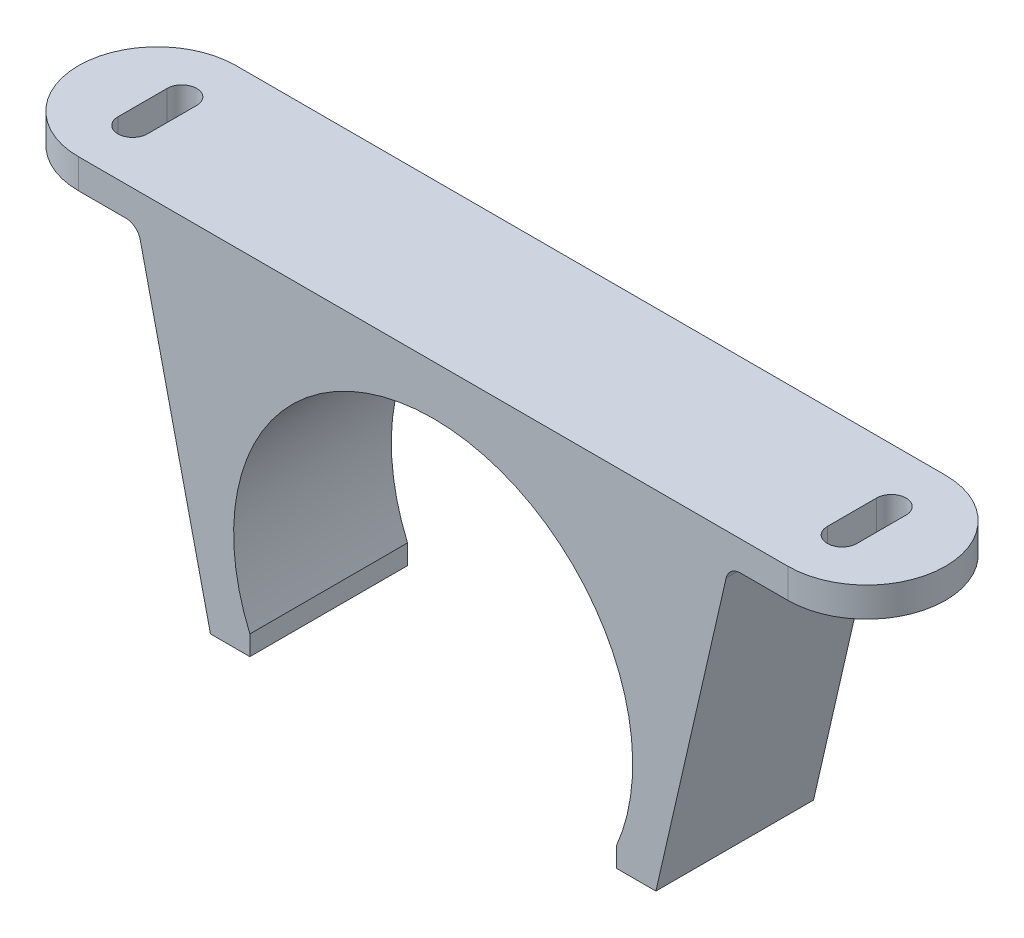
ISO-10303-21;
HEADER;
FILE_DESCRIPTION(('STEP AP214'),'2;1');
FILE_NAME('part.step','',(''),(''),'','','');
FILE_SCHEMA(('AUTOMOTIVE_DESIGN { 1 0 10303 214 1 1 1 1 }'));
ENDSEC;
DATA;
#1=APPLICATION_CONTEXT('core data for automotive mechanical design processes');
#2=APPLICATION_PROTOCOL_DEFINITION('international standard','automotive_design',2000,#1);
#3=PRODUCT_CONTEXT('',#1,'mechanical');
#4=PRODUCT('Part','Part','',(#3));
#5=PRODUCT_RELATED_PRODUCT_CATEGORY('part','',(#4));
#6=PRODUCT_DEFINITION_FORMATION('','',#4);
#7=PRODUCT_DEFINITION_CONTEXT('part definition',#1,'design');
#8=PRODUCT_DEFINITION('design','',#6,#7);
#9=PRODUCT_DEFINITION_SHAPE('','',#8);
#10=(LENGTH_UNIT() NAMED_UNIT(*) SI_UNIT(.MILLI.,.METRE.));
#11=(NAMED_UNIT(*) PLANE_ANGLE_UNIT() SI_UNIT($,.RADIAN.));
#12=(NAMED_UNIT(*) SI_UNIT($,.STERADIAN.) SOLID_ANGLE_UNIT());
#13=UNCERTAINTY_MEASURE_WITH_UNIT(LENGTH_MEASURE(1.E-05),#10,'distance_accuracy_value','');
#14=(GEOMETRIC_REPRESENTATION_CONTEXT(3) GLOBAL_UNCERTAINTY_ASSIGNED_CONTEXT((#13)) GLOBAL_UNIT_ASSIGNED_CONTEXT((#10,
#11,#12)) REPRESENTATION_CONTEXT('',''));
#15=CARTESIAN_POINT('',(0.,0.,0.));
#16=DIRECTION('',(0.,0.,1.));
#17=DIRECTION('',(1.,0.,0.));
#18=AXIS2_PLACEMENT_3D('',#15,#16,#17);
#19=CARTESIAN_POINT('',(0.,0.,16.));
#20=DIRECTION('',(0.,0.,-1.));
#21=DIRECTION('',(-1.,0.,0.));
#22=AXIS2_PLACEMENT_3D('',#19,#20,#21);
#23=CYLINDRICAL_SURFACE('',#22,20.25);
#24=CARTESIAN_POINT('',(0.,0.,0.));
#25=DIRECTION('',(0.,0.,-1.));
#26=DIRECTION('',(1.,0.,0.));
#27=AXIS2_PLACEMENT_3D('',#24,#25,#26);
#28=CIRCLE('',#27,20.25);
#29=CARTESIAN_POINT('',(-18.6027551722856,-8.,0.));
#30=VERTEX_POINT('',#29);
#31=CARTESIAN_POINT('',(18.6027551722856,-7.99999999999999,0.));
#32=VERTEX_POINT('',#31);
#33=EDGE_CURVE('E365',#30,#32,#28,.T.);
#34=ORIENTED_EDGE('',*,*,#33,.T.);
#35=DIRECTION('',(0.,0.,-1.));
#36=VECTOR('',#35,1.);
#37=CARTESIAN_POINT('',(18.6027551722856,-7.99999999999999,16.));
#38=LINE('',#37,#36);
#39=CARTESIAN_POINT('',(18.6027551722856,-7.99999999999999,16.));
#40=VERTEX_POINT('',#39);
#41=EDGE_CURVE('E325',#40,#32,#38,.T.);
#42=ORIENTED_EDGE('',*,*,#41,.F.);
#43=CARTESIAN_POINT('',(0.,0.,16.));
#44=DIRECTION('',(0.,0.,-1.));
#45=DIRECTION('',(1.,0.,0.));
#46=AXIS2_PLACEMENT_3D('',#43,#44,#45);
#47=CIRCLE('',#46,20.25);
#48=CARTESIAN_POINT('',(-18.6027551722856,-8.,16.));
#49=VERTEX_POINT('',#48);
#50=EDGE_CURVE('E286',#49,#40,#47,.T.);
#51=ORIENTED_EDGE('',*,*,#50,.F.);
#52=DIRECTION('',(0.,0.,-1.));
#53=VECTOR('',#52,1.);
#54=CARTESIAN_POINT('',(-18.6027551722856,-8.,16.));
#55=LINE('',#54,#53);
#56=EDGE_CURVE('E354',#49,#30,#55,.T.);
#57=ORIENTED_EDGE('',*,*,#56,.T.);
#58=EDGE_LOOP('',(#34,#42,#51,#57));
#59=FACE_BOUND('',#58,.T.);
#60=ADVANCED_FACE('F35',(#59),#23,.F.);
#61=CARTESIAN_POINT('',(18.6027551722856,-7.99999999999999,16.));
#62=DIRECTION('',(1.,0.,0.));
#63=DIRECTION('',(0.,0.,-1.));
#64=AXIS2_PLACEMENT_3D('',#61,#62,#63);
#65=PLANE('',#64);
#66=DIRECTION('',(0.,-1.,0.));
#67=VECTOR('',#66,1.);
#68=CARTESIAN_POINT('',(18.6027551722856,-7.99999999999999,0.));
#69=LINE('',#68,#67);
#70=CARTESIAN_POINT('',(18.6027551722856,-9.99999999999999,0.));
#71=VERTEX_POINT('',#70);
#72=EDGE_CURVE('E363',#32,#71,#69,.T.);
#73=ORIENTED_EDGE('',*,*,#72,.T.);
#74=DIRECTION('',(0.,0.,-1.));
#75=VECTOR('',#74,1.);
#76=CARTESIAN_POINT('',(18.6027551722856,-9.99999999999999,16.));
#77=LINE('',#76,#75);
#78=CARTESIAN_POINT('',(18.6027551722856,-9.99999999999999,16.));
#79=VERTEX_POINT('',#78);
#80=EDGE_CURVE('E327',#79,#71,#77,.T.);
#81=ORIENTED_EDGE('',*,*,#80,.F.);
#82=DIRECTION('',(0.,-1.,0.));
#83=VECTOR('',#82,1.);
#84=CARTESIAN_POINT('',(18.6027551722856,-7.99999999999999,16.));
#85=LINE('',#84,#83);
#86=EDGE_CURVE('E370',#40,#79,#85,.T.);
#87=ORIENTED_EDGE('',*,*,#86,.F.);
#88=ORIENTED_EDGE('',*,*,#41,.T.);
#89=EDGE_LOOP('',(#73,#81,#87,#88));
#90=FACE_BOUND('',#89,.T.);
#91=ADVANCED_FACE('F379',(#90),#65,.F.);
#92=CARTESIAN_POINT('',(18.6027551722856,-9.99999999999999,16.));
#93=DIRECTION('',(0.,1.,0.));
#94=DIRECTION('',(0.,0.,1.));
#95=AXIS2_PLACEMENT_3D('',#92,#93,#94);
#96=PLANE('',#95);
#97=DIRECTION('',(1.,0.,0.));
#98=VECTOR('',#97,1.);
#99=CARTESIAN_POINT('',(18.6027551722856,-9.99999999999999,0.));
#100=LINE('',#99,#98);
#101=CARTESIAN_POINT('',(22.6027551722856,-9.99999999999999,0.));
#102=VERTEX_POINT('',#101);
#103=EDGE_CURVE('E343',#71,#102,#100,.T.);
#104=ORIENTED_EDGE('',*,*,#103,.T.);
#105=DIRECTION('',(0.,0.,-1.));
#106=VECTOR('',#105,1.);
#107=CARTESIAN_POINT('',(22.6027551722856,-9.99999999999999,16.));
#108=LINE('',#107,#106);
#109=CARTESIAN_POINT('',(22.6027551722856,-9.99999999999999,16.));
#110=VERTEX_POINT('',#109);
#111=EDGE_CURVE('E347',#110,#102,#108,.T.);
#112=ORIENTED_EDGE('',*,*,#111,.F.);
#113=DIRECTION('',(1.,0.,0.));
#114=VECTOR('',#113,1.);
#115=CARTESIAN_POINT('',(18.6027551722856,-9.99999999999999,16.));
#116=LINE('',#115,#114);
#117=EDGE_CURVE('E339',#79,#110,#116,.T.);
#118=ORIENTED_EDGE('',*,*,#117,.F.);
#119=ORIENTED_EDGE('',*,*,#80,.T.);
#120=EDGE_LOOP('',(#104,#112,#118,#119));
#121=FACE_BOUND('',#120,.T.);
#122=ADVANCED_FACE('F384',(#121),#96,.F.);
#123=CARTESIAN_POINT('',(22.6027551722856,-9.99999999999999,16.));
#124=DIRECTION('',(-0.974688738265642,0.223566239620681,0.));
#125=DIRECTION('',(-0.223566239620681,-0.974688738265642,0.));
#126=AXIS2_PLACEMENT_3D('',#123,#124,#125);
#127=PLANE('',#126);
#128=DIRECTION('',(0.223566239620681,0.974688738265642,0.));
#129=VECTOR('',#128,1.);
#130=CARTESIAN_POINT('',(22.6027551722856,-9.99999999999999,0.));
#131=LINE('',#130,#129);
#132=CARTESIAN_POINT('',(29.7328618317196,21.085349359431,0.));
#133=VERTEX_POINT('',#132);
#134=EDGE_CURVE('E342',#102,#133,#131,.T.);
#135=ORIENTED_EDGE('',*,*,#134,.T.);
#136=DIRECTION('',(0.,0.,-1.));
#137=VECTOR('',#136,1.);
#138=CARTESIAN_POINT('',(29.7328618317196,21.085349359431,16.));
#139=LINE('',#138,#137);
#140=CARTESIAN_POINT('',(29.7328618317196,21.085349359431,16.));
#141=VERTEX_POINT('',#140);
#142=EDGE_CURVE('E50',#133,#141,#139,.F.);
#143=ORIENTED_EDGE('',*,*,#142,.T.);
#144=DIRECTION('',(0.223566239620681,0.974688738265642,0.));
#145=VECTOR('',#144,1.);
#146=CARTESIAN_POINT('',(22.6027551722856,-9.99999999999999,16.));
#147=LINE('',#146,#145);
#148=EDGE_CURVE('E322',#110,#141,#147,.T.);
#149=ORIENTED_EDGE('',*,*,#148,.F.);
#150=ORIENTED_EDGE('',*,*,#111,.T.);
#151=EDGE_LOOP('',(#135,#143,#149,#150));
#152=FACE_BOUND('',#151,.T.);
#153=ADVANCED_FACE('F423',(#152),#127,.F.);
#154=CARTESIAN_POINT('',(-30.,22.25,16.));
#155=DIRECTION('',(0.974688738265642,0.223566239620681,0.));
#156=DIRECTION('',(-0.223566239620681,0.974688738265642,0.));
#157=AXIS2_PLACEMENT_3D('',#154,#155,#156);
#158=PLANE('',#157);
#159=DIRECTION('',(0.223566239620681,-0.974688738265642,0.));
#160=VECTOR('',#159,1.);
#161=CARTESIAN_POINT('',(-30.,22.25,16.));
#162=LINE('',#161,#160);
#163=CARTESIAN_POINT('',(-29.7328618317196,21.085349359431,16.));
#164=VERTEX_POINT('',#163);
#165=CARTESIAN_POINT('',(-22.6027551722856,-10.,16.));
#166=VERTEX_POINT('',#165);
#167=EDGE_CURVE('E307',#164,#166,#162,.T.);
#168=ORIENTED_EDGE('',*,*,#167,.F.);
#169=DIRECTION('',(0.,0.,-1.));
#170=VECTOR('',#169,1.);
#171=CARTESIAN_POINT('',(-29.7328618317196,21.085349359431,16.));
#172=LINE('',#171,#170);
#173=CARTESIAN_POINT('',(-29.7328618317196,21.085349359431,0.));
#174=VERTEX_POINT('',#173);
#175=EDGE_CURVE('E316',#164,#174,#172,.T.);
#176=ORIENTED_EDGE('',*,*,#175,.T.);
#177=DIRECTION('',(0.223566239620681,-0.974688738265642,0.));
#178=VECTOR('',#177,1.);
#179=CARTESIAN_POINT('',(-30.,22.25,0.));
#180=LINE('',#179,#178);
#181=CARTESIAN_POINT('',(-22.6027551722856,-10.,0.));
#182=VERTEX_POINT('',#181);
#183=EDGE_CURVE('E331',#174,#182,#180,.T.);
#184=ORIENTED_EDGE('',*,*,#183,.T.);
#185=DIRECTION('',(0.,0.,-1.));
#186=VECTOR('',#185,1.);
#187=CARTESIAN_POINT('',(-22.6027551722856,-10.,16.));
#188=LINE('',#187,#186);
#189=EDGE_CURVE('E319',#166,#182,#188,.T.);
#190=ORIENTED_EDGE('',*,*,#189,.F.);
#191=EDGE_LOOP('',(#168,#176,#184,#190));
#192=FACE_BOUND('',#191,.T.);
#193=ADVANCED_FACE('F315',(#192),#158,.F.);
#194=CARTESIAN_POINT('',(-22.6027551722856,-10.,16.));
#195=DIRECTION('',(0.,1.,0.));
#196=DIRECTION('',(0.,0.,1.));
#197=AXIS2_PLACEMENT_3D('',#194,#195,#196);
#198=PLANE('',#197);
#199=DIRECTION('',(1.,0.,0.));
#200=VECTOR('',#199,1.);
#201=CARTESIAN_POINT('',(-22.6027551722856,-10.,0.));
#202=LINE('',#201,#200);
#203=CARTESIAN_POINT('',(-18.6027551722856,-10.,0.));
#204=VERTEX_POINT('',#203);
#205=EDGE_CURVE('E360',#182,#204,#202,.T.);
#206=ORIENTED_EDGE('',*,*,#205,.T.);
#207=DIRECTION('',(0.,0.,-1.));
#208=VECTOR('',#207,1.);
#209=CARTESIAN_POINT('',(-18.6027551722856,-10.,16.));
#210=LINE('',#209,#208);
#211=CARTESIAN_POINT('',(-18.6027551722856,-10.,16.));
#212=VERTEX_POINT('',#211);
#213=EDGE_CURVE('E351',#212,#204,#210,.T.);
#214=ORIENTED_EDGE('',*,*,#213,.F.);
#215=DIRECTION('',(1.,0.,0.));
#216=VECTOR('',#215,1.);
#217=CARTESIAN_POINT('',(-22.6027551722856,-10.,16.));
#218=LINE('',#217,#216);
#219=EDGE_CURVE('E321',#166,#212,#218,.T.);
#220=ORIENTED_EDGE('',*,*,#219,.F.);
#221=ORIENTED_EDGE('',*,*,#189,.T.);
#222=EDGE_LOOP('',(#206,#214,#220,#221));
#223=FACE_BOUND('',#222,.T.);
#224=ADVANCED_FACE('F419',(#223),#198,.F.);
#225=CARTESIAN_POINT('',(-18.6027551722856,-10.,16.));
#226=DIRECTION('',(-1.,0.,0.));
#227=DIRECTION('',(0.,0.,1.));
#228=AXIS2_PLACEMENT_3D('',#225,#226,#227);
#229=PLANE('',#228);
#230=DIRECTION('',(0.,1.,0.));
#231=VECTOR('',#230,1.);
#232=CARTESIAN_POINT('',(-18.6027551722856,-10.,0.));
#233=LINE('',#232,#231);
#234=EDGE_CURVE('E358',#204,#30,#233,.T.);
#235=ORIENTED_EDGE('',*,*,#234,.T.);
#236=ORIENTED_EDGE('',*,*,#56,.F.);
#237=DIRECTION('',(0.,1.,0.));
#238=VECTOR('',#237,1.);
#239=CARTESIAN_POINT('',(-18.6027551722856,-10.,16.));
#240=LINE('',#239,#238);
#241=EDGE_CURVE('E357',#212,#49,#240,.T.);
#242=ORIENTED_EDGE('',*,*,#241,.F.);
#243=ORIENTED_EDGE('',*,*,#213,.T.);
#244=EDGE_LOOP('',(#235,#236,#242,#243));
#245=FACE_BOUND('',#244,.T.);
#246=ADVANCED_FACE('F422',(#245),#229,.F.);
#247=CARTESIAN_POINT('',(0.,0.,16.));
#248=DIRECTION('',(0.,0.,1.));
#249=DIRECTION('',(1.,0.,0.));
#250=AXIS2_PLACEMENT_3D('',#247,#248,#249);
#251=PLANE('',#250);
#252=ORIENTED_EDGE('',*,*,#50,.T.);
#253=ORIENTED_EDGE('',*,*,#86,.T.);
#254=ORIENTED_EDGE('',*,*,#117,.T.);
#255=ORIENTED_EDGE('',*,*,#148,.T.);
#256=CARTESIAN_POINT('',(31.1948949391181,20.75,16.));
#257=DIRECTION('',(0.,0.,1.));
#258=DIRECTION('',(1.,0.,0.));
#259=AXIS2_PLACEMENT_3D('',#256,#257,#258);
#260=CIRCLE('',#259,1.5);
#261=CARTESIAN_POINT('',(31.1948949391181,22.25,16.));
#262=VERTEX_POINT('',#261);
#263=EDGE_CURVE('E11',#141,#262,#260,.F.);
#264=ORIENTED_EDGE('',*,*,#263,.T.);
#265=DIRECTION('',(1.,0.,0.));
#266=VECTOR('',#265,1.);
#267=CARTESIAN_POINT('',(30.,22.25,16.));
#268=LINE('',#267,#266);
#269=CARTESIAN_POINT('',(36.,22.25,16.));
#270=VERTEX_POINT('',#269);
#271=EDGE_CURVE('E285',#262,#270,#268,.T.);
#272=ORIENTED_EDGE('',*,*,#271,.T.);
#273=DIRECTION('',(0.,-1.,0.));
#274=VECTOR('',#273,1.);
#275=CARTESIAN_POINT('',(36.,25.25,16.));
#276=LINE('',#275,#274);
#277=CARTESIAN_POINT('',(36.,25.25,16.));
#278=VERTEX_POINT('',#277);
#279=EDGE_CURVE('E401',#278,#270,#276,.T.);
#280=ORIENTED_EDGE('',*,*,#279,.F.);
#281=DIRECTION('',(1.,0.,0.));
#282=VECTOR('',#281,1.);
#283=CARTESIAN_POINT('',(-30.,25.25,16.));
#284=LINE('',#283,#282);
#285=CARTESIAN_POINT('',(-36.,25.25,16.));
#286=VERTEX_POINT('',#285);
#287=EDGE_CURVE('E263',#286,#278,#284,.T.);
#288=ORIENTED_EDGE('',*,*,#287,.F.);
#289=DIRECTION('',(0.,-1.,0.));
#290=VECTOR('',#289,1.);
#291=CARTESIAN_POINT('',(-36.,25.25,16.));
#292=LINE('',#291,#290);
#293=CARTESIAN_POINT('',(-36.,22.25,16.));
#294=VERTEX_POINT('',#293);
#295=EDGE_CURVE('E403',#286,#294,#292,.T.);
#296=ORIENTED_EDGE('',*,*,#295,.T.);
#297=CARTESIAN_POINT('',(-31.194894939118,22.25,16.));
#298=VERTEX_POINT('',#297);
#299=EDGE_CURVE('E282',#294,#298,#268,.T.);
#300=ORIENTED_EDGE('',*,*,#299,.T.);
#301=CARTESIAN_POINT('',(-31.1948949391181,20.75,16.));
#302=DIRECTION('',(0.,0.,1.));
#303=DIRECTION('',(1.,0.,0.));
#304=AXIS2_PLACEMENT_3D('',#301,#302,#303);
#305=CIRCLE('',#304,1.5);
#306=EDGE_CURVE('E301',#298,#164,#305,.F.);
#307=ORIENTED_EDGE('',*,*,#306,.T.);
#308=ORIENTED_EDGE('',*,*,#167,.T.);
#309=ORIENTED_EDGE('',*,*,#219,.T.);
#310=ORIENTED_EDGE('',*,*,#241,.T.);
#311=EDGE_LOOP('',(#252,#253,#254,#255,#264,#272,#280,#288,#296,#300,#307,#308,#309,#310));
#312=FACE_BOUND('',#311,.T.);
#313=ADVANCED_FACE('F306',(#312),#251,.T.);
#314=CARTESIAN_POINT('',(0.,0.,0.));
#315=DIRECTION('',(0.,0.,1.));
#316=DIRECTION('',(1.,0.,0.));
#317=AXIS2_PLACEMENT_3D('',#314,#315,#316);
#318=PLANE('',#317);
#319=ORIENTED_EDGE('',*,*,#33,.F.);
#320=ORIENTED_EDGE('',*,*,#234,.F.);
#321=ORIENTED_EDGE('',*,*,#205,.F.);
#322=ORIENTED_EDGE('',*,*,#183,.F.);
#323=CARTESIAN_POINT('',(-31.1948949391181,20.75,0.));
#324=DIRECTION('',(0.,0.,1.));
#325=DIRECTION('',(1.,0.,0.));
#326=AXIS2_PLACEMENT_3D('',#323,#324,#325);
#327=CIRCLE('',#326,1.5);
#328=CARTESIAN_POINT('',(-31.1948949391181,22.25,0.));
#329=VERTEX_POINT('',#328);
#330=EDGE_CURVE('E299',#174,#329,#327,.T.);
#331=ORIENTED_EDGE('',*,*,#330,.T.);
#332=DIRECTION('',(-1.,0.,0.));
#333=VECTOR('',#332,1.);
#334=CARTESIAN_POINT('',(-30.,22.25,0.));
#335=LINE('',#334,#333);
#336=CARTESIAN_POINT('',(-36.,22.25,0.));
#337=VERTEX_POINT('',#336);
#338=EDGE_CURVE('E257',#329,#337,#335,.T.);
#339=ORIENTED_EDGE('',*,*,#338,.T.);
#340=DIRECTION('',(0.,-1.,0.));
#341=VECTOR('',#340,1.);
#342=CARTESIAN_POINT('',(-36.,25.25,0.));
#343=LINE('',#342,#341);
#344=CARTESIAN_POINT('',(-36.,25.25,0.));
#345=VERTEX_POINT('',#344);
#346=EDGE_CURVE('E280',#345,#337,#343,.T.);
#347=ORIENTED_EDGE('',*,*,#346,.F.);
#348=DIRECTION('',(-1.,0.,0.));
#349=VECTOR('',#348,1.);
#350=CARTESIAN_POINT('',(30.,25.25,0.));
#351=LINE('',#350,#349);
#352=CARTESIAN_POINT('',(36.,25.25,0.));
#353=VERTEX_POINT('',#352);
#354=EDGE_CURVE('E258',#353,#345,#351,.T.);
#355=ORIENTED_EDGE('',*,*,#354,.F.);
#356=DIRECTION('',(0.,-1.,0.));
#357=VECTOR('',#356,1.);
#358=CARTESIAN_POINT('',(36.,25.25,0.));
#359=LINE('',#358,#357);
#360=CARTESIAN_POINT('',(36.,22.25,0.));
#361=VERTEX_POINT('',#360);
#362=EDGE_CURVE('E267',#353,#361,#359,.T.);
#363=ORIENTED_EDGE('',*,*,#362,.T.);
#364=CARTESIAN_POINT('',(31.1948949391181,22.25,0.));
#365=VERTEX_POINT('',#364);
#366=EDGE_CURVE('E277',#361,#365,#335,.T.);
#367=ORIENTED_EDGE('',*,*,#366,.T.);
#368=CARTESIAN_POINT('',(31.1948949391181,20.75,0.));
#369=DIRECTION('',(0.,0.,1.));
#370=DIRECTION('',(1.,0.,0.));
#371=AXIS2_PLACEMENT_3D('',#368,#369,#370);
#372=CIRCLE('',#371,1.5);
#373=EDGE_CURVE('E43',#365,#133,#372,.T.);
#374=ORIENTED_EDGE('',*,*,#373,.T.);
#375=ORIENTED_EDGE('',*,*,#134,.F.);
#376=ORIENTED_EDGE('',*,*,#103,.F.);
#377=ORIENTED_EDGE('',*,*,#72,.F.);
#378=EDGE_LOOP('',(#319,#320,#321,#322,#331,#339,#347,#355,#363,#367,#374,#375,#376,#377));
#379=FACE_BOUND('',#378,.T.);
#380=ADVANCED_FACE('F395',(#379),#318,.F.);
#381=CARTESIAN_POINT('',(36.,22.25,8.));
#382=DIRECTION('',(0.,-1.,0.));
#383=DIRECTION('',(0.,0.,-1.));
#384=AXIS2_PLACEMENT_3D('',#381,#382,#383);
#385=PLANE('',#384);
#386=DIRECTION('',(0.,0.,1.));
#387=VECTOR('',#386,1.);
#388=CARTESIAN_POINT('',(-37.5,22.25,10.5));
#389=LINE('',#388,#387);
#390=CARTESIAN_POINT('',(-37.5,22.25,5.5));
#391=VERTEX_POINT('',#390);
#392=CARTESIAN_POINT('',(-37.5,22.25,10.5));
#393=VERTEX_POINT('',#392);
#394=EDGE_CURVE('E230',#391,#393,#389,.T.);
#395=ORIENTED_EDGE('',*,*,#394,.T.);
#396=CARTESIAN_POINT('',(-36.,22.25,10.5));
#397=DIRECTION('',(0.,1.,0.));
#398=DIRECTION('',(0.,0.,1.));
#399=AXIS2_PLACEMENT_3D('',#396,#397,#398);
#400=CIRCLE('',#399,1.50000000000001);
#401=CARTESIAN_POINT('',(-34.5,22.25,10.5));
#402=VERTEX_POINT('',#401);
#403=EDGE_CURVE('E203',#393,#402,#400,.T.);
#404=ORIENTED_EDGE('',*,*,#403,.T.);
#405=DIRECTION('',(0.,0.,-1.));
#406=VECTOR('',#405,1.);
#407=CARTESIAN_POINT('',(-34.5,22.25,10.5));
#408=LINE('',#407,#406);
#409=CARTESIAN_POINT('',(-34.5,22.25,5.5));
#410=VERTEX_POINT('',#409);
#411=EDGE_CURVE('E240',#402,#410,#408,.T.);
#412=ORIENTED_EDGE('',*,*,#411,.T.);
#413=CARTESIAN_POINT('',(-36.,22.25,5.5));
#414=DIRECTION('',(0.,1.,0.));
#415=DIRECTION('',(0.,0.,1.));
#416=AXIS2_PLACEMENT_3D('',#413,#414,#415);
#417=CIRCLE('',#416,1.50000000000001);
#418=EDGE_CURVE('E243',#410,#391,#417,.T.);
#419=ORIENTED_EDGE('',*,*,#418,.T.);
#420=EDGE_LOOP('',(#395,#404,#412,#419));
#421=FACE_BOUND('',#420,.T.);
#422=ORIENTED_EDGE('',*,*,#338,.F.);
#423=DIRECTION('',(0.,0.,-1.));
#424=VECTOR('',#423,1.);
#425=CARTESIAN_POINT('',(-31.194894939118,22.25,8.));
#426=LINE('',#425,#424);
#427=EDGE_CURVE('E294',#329,#298,#426,.F.);
#428=ORIENTED_EDGE('',*,*,#427,.T.);
#429=ORIENTED_EDGE('',*,*,#299,.F.);
#430=CARTESIAN_POINT('',(-36.,22.25,8.));
#431=DIRECTION('',(0.,1.,0.));
#432=DIRECTION('',(0.,0.,1.));
#433=AXIS2_PLACEMENT_3D('',#430,#431,#432);
#434=CIRCLE('',#433,8.);
#435=EDGE_CURVE('E270',#337,#294,#434,.T.);
#436=ORIENTED_EDGE('',*,*,#435,.F.);
#437=EDGE_LOOP('',(#422,#428,#429,#436));
#438=FACE_BOUND('',#437,.T.);
#439=ADVANCED_FACE('F415',(#421,#438),#385,.T.);
#440=CARTESIAN_POINT('',(36.,25.25,8.));
#441=DIRECTION('',(0.,-1.,0.));
#442=DIRECTION('',(0.,0.,-1.));
#443=AXIS2_PLACEMENT_3D('',#440,#441,#442);
#444=PLANE('',#443);
#445=CARTESIAN_POINT('',(-36.,25.25,10.5));
#446=DIRECTION('',(0.,1.,0.));
#447=DIRECTION('',(0.,0.,1.));
#448=AXIS2_PLACEMENT_3D('',#445,#446,#447);
#449=CIRCLE('',#448,1.50000000000001);
#450=CARTESIAN_POINT('',(-37.5,25.25,10.5));
#451=VERTEX_POINT('',#450);
#452=CARTESIAN_POINT('',(-34.5,25.25,10.5));
#453=VERTEX_POINT('',#452);
#454=EDGE_CURVE('E227',#451,#453,#449,.T.);
#455=ORIENTED_EDGE('',*,*,#454,.F.);
#456=DIRECTION('',(0.,0.,1.));
#457=VECTOR('',#456,1.);
#458=CARTESIAN_POINT('',(-37.5,25.25,10.5));
#459=LINE('',#458,#457);
#460=CARTESIAN_POINT('',(-37.5,25.25,5.5));
#461=VERTEX_POINT('',#460);
#462=EDGE_CURVE('E235',#461,#451,#459,.T.);
#463=ORIENTED_EDGE('',*,*,#462,.F.);
#464=CARTESIAN_POINT('',(-36.,25.25,5.5));
#465=DIRECTION('',(0.,1.,0.));
#466=DIRECTION('',(0.,0.,1.));
#467=AXIS2_PLACEMENT_3D('',#464,#465,#466);
#468=CIRCLE('',#467,1.50000000000001);
#469=CARTESIAN_POINT('',(-34.5,25.25,5.5));
#470=VERTEX_POINT('',#469);
#471=EDGE_CURVE('E232',#470,#461,#468,.T.);
#472=ORIENTED_EDGE('',*,*,#471,.F.);
#473=DIRECTION('',(0.,0.,-1.));
#474=VECTOR('',#473,1.);
#475=CARTESIAN_POINT('',(-34.5,25.25,10.5));
#476=LINE('',#475,#474);
#477=EDGE_CURVE('E229',#453,#470,#476,.T.);
#478=ORIENTED_EDGE('',*,*,#477,.F.);
#479=EDGE_LOOP('',(#455,#463,#472,#478));
#480=FACE_BOUND('',#479,.T.);
#481=ORIENTED_EDGE('',*,*,#354,.T.);
#482=CARTESIAN_POINT('',(-36.,25.25,8.));
#483=DIRECTION('',(0.,1.,0.));
#484=DIRECTION('',(0.,0.,1.));
#485=AXIS2_PLACEMENT_3D('',#482,#483,#484);
#486=CIRCLE('',#485,8.);
#487=EDGE_CURVE('E260',#345,#286,#486,.T.);
#488=ORIENTED_EDGE('',*,*,#487,.T.);
#489=ORIENTED_EDGE('',*,*,#287,.T.);
#490=CARTESIAN_POINT('',(36.,25.25,8.));
#491=DIRECTION('',(0.,1.,0.));
#492=DIRECTION('',(0.,0.,-1.));
#493=AXIS2_PLACEMENT_3D('',#490,#491,#492);
#494=CIRCLE('',#493,8.);
#495=EDGE_CURVE('E265',#278,#353,#494,.T.);
#496=ORIENTED_EDGE('',*,*,#495,.T.);
#497=EDGE_LOOP('',(#481,#488,#489,#496));
#498=FACE_BOUND('',#497,.T.);
#499=CARTESIAN_POINT('',(36.,25.25,10.5));
#500=DIRECTION('',(0.,1.,0.));
#501=DIRECTION('',(0.,0.,1.));
#502=AXIS2_PLACEMENT_3D('',#499,#500,#501);
#503=CIRCLE('',#502,1.5);
#504=CARTESIAN_POINT('',(34.5,25.25,10.5));
#505=VERTEX_POINT('',#504);
#506=CARTESIAN_POINT('',(37.5,25.25,10.5));
#507=VERTEX_POINT('',#506);
#508=EDGE_CURVE('E185',#505,#507,#503,.T.);
#509=ORIENTED_EDGE('',*,*,#508,.F.);
#510=DIRECTION('',(0.,0.,1.));
#511=VECTOR('',#510,1.);
#512=CARTESIAN_POINT('',(34.5,25.25,10.5));
#513=LINE('',#512,#511);
#514=CARTESIAN_POINT('',(34.5,25.25,5.5));
#515=VERTEX_POINT('',#514);
#516=EDGE_CURVE('E211',#515,#505,#513,.T.);
#517=ORIENTED_EDGE('',*,*,#516,.F.);
#518=CARTESIAN_POINT('',(36.,25.25,5.5));
#519=DIRECTION('',(0.,1.,0.));
#520=DIRECTION('',(0.,0.,1.));
#521=AXIS2_PLACEMENT_3D('',#518,#519,#520);
#522=CIRCLE('',#521,1.5);
#523=CARTESIAN_POINT('',(37.5,25.25,5.5));
#524=VERTEX_POINT('',#523);
#525=EDGE_CURVE('E209',#524,#515,#522,.T.);
#526=ORIENTED_EDGE('',*,*,#525,.F.);
#527=DIRECTION('',(0.,0.,-1.));
#528=VECTOR('',#527,1.);
#529=CARTESIAN_POINT('',(37.5,25.25,10.5));
#530=LINE('',#529,#528);
#531=EDGE_CURVE('E195',#507,#524,#530,.T.);
#532=ORIENTED_EDGE('',*,*,#531,.F.);
#533=EDGE_LOOP('',(#509,#517,#526,#532));
#534=FACE_BOUND('',#533,.T.);
#535=ADVANCED_FACE('F207',(#480,#498,#534),#444,.F.);
#536=ORIENTED_EDGE('',*,*,#271,.F.);
#537=DIRECTION('',(0.,0.,-1.));
#538=VECTOR('',#537,1.);
#539=CARTESIAN_POINT('',(31.1948949391181,22.25,8.));
#540=LINE('',#539,#538);
#541=EDGE_CURVE('E295',#262,#365,#540,.T.);
#542=ORIENTED_EDGE('',*,*,#541,.T.);
#543=ORIENTED_EDGE('',*,*,#366,.F.);
#544=CARTESIAN_POINT('',(36.,22.25,8.));
#545=DIRECTION('',(0.,1.,0.));
#546=DIRECTION('',(0.,0.,-1.));
#547=AXIS2_PLACEMENT_3D('',#544,#545,#546);
#548=CIRCLE('',#547,8.);
#549=EDGE_CURVE('E261',#270,#361,#548,.T.);
#550=ORIENTED_EDGE('',*,*,#549,.F.);
#551=EDGE_LOOP('',(#536,#542,#543,#550));
#552=FACE_BOUND('',#551,.T.);
#553=DIRECTION('',(0.,0.,1.));
#554=VECTOR('',#553,1.);
#555=CARTESIAN_POINT('',(34.5,22.25,10.5));
#556=LINE('',#555,#554);
#557=CARTESIAN_POINT('',(34.5,22.25,5.5));
#558=VERTEX_POINT('',#557);
#559=CARTESIAN_POINT('',(34.5,22.25,10.5));
#560=VERTEX_POINT('',#559);
#561=EDGE_CURVE('E196',#558,#560,#556,.T.);
#562=ORIENTED_EDGE('',*,*,#561,.T.);
#563=CARTESIAN_POINT('',(36.,22.25,10.5));
#564=DIRECTION('',(0.,1.,0.));
#565=DIRECTION('',(0.,0.,1.));
#566=AXIS2_PLACEMENT_3D('',#563,#564,#565);
#567=CIRCLE('',#566,1.5);
#568=CARTESIAN_POINT('',(37.5,22.25,10.5));
#569=VERTEX_POINT('',#568);
#570=EDGE_CURVE('E215',#560,#569,#567,.T.);
#571=ORIENTED_EDGE('',*,*,#570,.T.);
#572=DIRECTION('',(0.,0.,-1.));
#573=VECTOR('',#572,1.);
#574=CARTESIAN_POINT('',(37.5,22.25,10.5));
#575=LINE('',#574,#573);
#576=CARTESIAN_POINT('',(37.5,22.25,5.5));
#577=VERTEX_POINT('',#576);
#578=EDGE_CURVE('E202',#569,#577,#575,.T.);
#579=ORIENTED_EDGE('',*,*,#578,.T.);
#580=CARTESIAN_POINT('',(36.,22.25,5.5));
#581=DIRECTION('',(0.,1.,0.));
#582=DIRECTION('',(0.,0.,1.));
#583=AXIS2_PLACEMENT_3D('',#580,#581,#582);
#584=CIRCLE('',#583,1.5);
#585=EDGE_CURVE('E218',#577,#558,#584,.T.);
#586=ORIENTED_EDGE('',*,*,#585,.T.);
#587=EDGE_LOOP('',(#562,#571,#579,#586));
#588=FACE_BOUND('',#587,.T.);
#589=ADVANCED_FACE('F390',(#552,#588),#385,.T.);
#590=CARTESIAN_POINT('',(-36.,25.25,8.));
#591=DIRECTION('',(0.,-1.,0.));
#592=DIRECTION('',(0.,0.,-1.));
#593=AXIS2_PLACEMENT_3D('',#590,#591,#592);
#594=CYLINDRICAL_SURFACE('',#593,8.);
#595=ORIENTED_EDGE('',*,*,#435,.T.);
#596=ORIENTED_EDGE('',*,*,#295,.F.);
#597=ORIENTED_EDGE('',*,*,#487,.F.);
#598=ORIENTED_EDGE('',*,*,#346,.T.);
#599=EDGE_LOOP('',(#595,#596,#597,#598));
#600=FACE_BOUND('',#599,.T.);
#601=ADVANCED_FACE('F412',(#600),#594,.T.);
#602=CARTESIAN_POINT('',(36.,25.25,8.));
#603=DIRECTION('',(0.,-1.,0.));
#604=DIRECTION('',(0.,0.,-1.));
#605=AXIS2_PLACEMENT_3D('',#602,#603,#604);
#606=CYLINDRICAL_SURFACE('',#605,8.);
#607=ORIENTED_EDGE('',*,*,#549,.T.);
#608=ORIENTED_EDGE('',*,*,#362,.F.);
#609=ORIENTED_EDGE('',*,*,#495,.F.);
#610=ORIENTED_EDGE('',*,*,#279,.T.);
#611=EDGE_LOOP('',(#607,#608,#609,#610));
#612=FACE_BOUND('',#611,.T.);
#613=ADVANCED_FACE('F473',(#612),#606,.T.);
#614=CARTESIAN_POINT('',(-36.,25.25,10.5));
#615=DIRECTION('',(0.,-1.,0.));
#616=DIRECTION('',(0.,0.,-1.));
#617=AXIS2_PLACEMENT_3D('',#614,#615,#616);
#618=CYLINDRICAL_SURFACE('',#617,1.50000000000001);
#619=ORIENTED_EDGE('',*,*,#403,.F.);
#620=DIRECTION('',(0.,-1.,0.));
#621=VECTOR('',#620,1.);
#622=CARTESIAN_POINT('',(-37.5,25.25,10.5));
#623=LINE('',#622,#621);
#624=EDGE_CURVE('E237',#451,#393,#623,.T.);
#625=ORIENTED_EDGE('',*,*,#624,.F.);
#626=ORIENTED_EDGE('',*,*,#454,.T.);
#627=DIRECTION('',(0.,-1.,0.));
#628=VECTOR('',#627,1.);
#629=CARTESIAN_POINT('',(-34.5,25.25,10.5));
#630=LINE('',#629,#628);
#631=EDGE_CURVE('E254',#453,#402,#630,.T.);
#632=ORIENTED_EDGE('',*,*,#631,.T.);
#633=EDGE_LOOP('',(#619,#625,#626,#632));
#634=FACE_BOUND('',#633,.T.);
#635=ADVANCED_FACE('F469',(#634),#618,.F.);
#636=CARTESIAN_POINT('',(-34.5,25.25,10.5));
#637=DIRECTION('',(-1.,0.,0.));
#638=DIRECTION('',(0.,0.,1.));
#639=AXIS2_PLACEMENT_3D('',#636,#637,#638);
#640=PLANE('',#639);
#641=ORIENTED_EDGE('',*,*,#411,.F.);
#642=ORIENTED_EDGE('',*,*,#631,.F.);
#643=ORIENTED_EDGE('',*,*,#477,.T.);
#644=DIRECTION('',(0.,-1.,0.));
#645=VECTOR('',#644,1.);
#646=CARTESIAN_POINT('',(-34.5,25.25,5.5));
#647=LINE('',#646,#645);
#648=EDGE_CURVE('E252',#470,#410,#647,.T.);
#649=ORIENTED_EDGE('',*,*,#648,.T.);
#650=EDGE_LOOP('',(#641,#642,#643,#649));
#651=FACE_BOUND('',#650,.T.);
#652=ADVANCED_FACE('F465',(#651),#640,.T.);
#653=CARTESIAN_POINT('',(-36.,25.25,5.5));
#654=DIRECTION('',(0.,-1.,0.));
#655=DIRECTION('',(0.,0.,-1.));
#656=AXIS2_PLACEMENT_3D('',#653,#654,#655);
#657=CYLINDRICAL_SURFACE('',#656,1.50000000000001);
#658=ORIENTED_EDGE('',*,*,#418,.F.);
#659=ORIENTED_EDGE('',*,*,#648,.F.);
#660=ORIENTED_EDGE('',*,*,#471,.T.);
#661=DIRECTION('',(0.,-1.,0.));
#662=VECTOR('',#661,1.);
#663=CARTESIAN_POINT('',(-37.5,25.25,5.5));
#664=LINE('',#663,#662);
#665=EDGE_CURVE('E250',#461,#391,#664,.T.);
#666=ORIENTED_EDGE('',*,*,#665,.T.);
#667=EDGE_LOOP('',(#658,#659,#660,#666));
#668=FACE_BOUND('',#667,.T.);
#669=ADVANCED_FACE('F461',(#668),#657,.F.);
#670=CARTESIAN_POINT('',(-37.5,25.25,10.5));
#671=DIRECTION('',(1.,0.,0.));
#672=DIRECTION('',(0.,0.,-1.));
#673=AXIS2_PLACEMENT_3D('',#670,#671,#672);
#674=PLANE('',#673);
#675=ORIENTED_EDGE('',*,*,#394,.F.);
#676=ORIENTED_EDGE('',*,*,#665,.F.);
#677=ORIENTED_EDGE('',*,*,#462,.T.);
#678=ORIENTED_EDGE('',*,*,#624,.T.);
#679=EDGE_LOOP('',(#675,#676,#677,#678));
#680=FACE_BOUND('',#679,.T.);
#681=ADVANCED_FACE('F458',(#680),#674,.T.);
#682=CARTESIAN_POINT('',(36.,25.25,10.5));
#683=DIRECTION('',(0.,-1.,0.));
#684=DIRECTION('',(0.,0.,-1.));
#685=AXIS2_PLACEMENT_3D('',#682,#683,#684);
#686=CYLINDRICAL_SURFACE('',#685,1.5);
#687=ORIENTED_EDGE('',*,*,#570,.F.);
#688=DIRECTION('',(0.,-1.,0.));
#689=VECTOR('',#688,1.);
#690=CARTESIAN_POINT('',(34.5,25.25,10.5));
#691=LINE('',#690,#689);
#692=EDGE_CURVE('E191',#505,#560,#691,.T.);
#693=ORIENTED_EDGE('',*,*,#692,.F.);
#694=ORIENTED_EDGE('',*,*,#508,.T.);
#695=DIRECTION('',(0.,-1.,0.));
#696=VECTOR('',#695,1.);
#697=CARTESIAN_POINT('',(37.5,25.25,10.5));
#698=LINE('',#697,#696);
#699=EDGE_CURVE('E188',#507,#569,#698,.T.);
#700=ORIENTED_EDGE('',*,*,#699,.T.);
#701=EDGE_LOOP('',(#687,#693,#694,#700));
#702=FACE_BOUND('',#701,.T.);
#703=ADVANCED_FACE('F187',(#702),#686,.F.);
#704=CARTESIAN_POINT('',(37.5,25.25,10.5));
#705=DIRECTION('',(-1.,0.,0.));
#706=DIRECTION('',(0.,0.,1.));
#707=AXIS2_PLACEMENT_3D('',#704,#705,#706);
#708=PLANE('',#707);
#709=ORIENTED_EDGE('',*,*,#578,.F.);
#710=ORIENTED_EDGE('',*,*,#699,.F.);
#711=ORIENTED_EDGE('',*,*,#531,.T.);
#712=DIRECTION('',(0.,-1.,0.));
#713=VECTOR('',#712,1.);
#714=CARTESIAN_POINT('',(37.5,25.25,5.5));
#715=LINE('',#714,#713);
#716=EDGE_CURVE('E204',#524,#577,#715,.T.);
#717=ORIENTED_EDGE('',*,*,#716,.T.);
#718=EDGE_LOOP('',(#709,#710,#711,#717));
#719=FACE_BOUND('',#718,.T.);
#720=ADVANCED_FACE('F199',(#719),#708,.T.);
#721=CARTESIAN_POINT('',(36.,25.25,5.5));
#722=DIRECTION('',(0.,-1.,0.));
#723=DIRECTION('',(0.,0.,-1.));
#724=AXIS2_PLACEMENT_3D('',#721,#722,#723);
#725=CYLINDRICAL_SURFACE('',#724,1.5);
#726=ORIENTED_EDGE('',*,*,#585,.F.);
#727=ORIENTED_EDGE('',*,*,#716,.F.);
#728=ORIENTED_EDGE('',*,*,#525,.T.);
#729=DIRECTION('',(0.,-1.,0.));
#730=VECTOR('',#729,1.);
#731=CARTESIAN_POINT('',(34.5,25.25,5.5));
#732=LINE('',#731,#730);
#733=EDGE_CURVE('E224',#515,#558,#732,.T.);
#734=ORIENTED_EDGE('',*,*,#733,.T.);
#735=EDGE_LOOP('',(#726,#727,#728,#734));
#736=FACE_BOUND('',#735,.T.);
#737=ADVANCED_FACE('F444',(#736),#725,.F.);
#738=CARTESIAN_POINT('',(34.5,25.25,10.5));
#739=DIRECTION('',(1.,0.,0.));
#740=DIRECTION('',(0.,0.,-1.));
#741=AXIS2_PLACEMENT_3D('',#738,#739,#740);
#742=PLANE('',#741);
#743=ORIENTED_EDGE('',*,*,#561,.F.);
#744=ORIENTED_EDGE('',*,*,#733,.F.);
#745=ORIENTED_EDGE('',*,*,#516,.T.);
#746=ORIENTED_EDGE('',*,*,#692,.T.);
#747=EDGE_LOOP('',(#743,#744,#745,#746));
#748=FACE_BOUND('',#747,.T.);
#749=ADVANCED_FACE('F439',(#748),#742,.T.);
#750=CARTESIAN_POINT('',(-31.1948949391181,20.75,16.));
#751=DIRECTION('',(0.,0.,-1.));
#752=DIRECTION('',(-1.,0.,0.));
#753=AXIS2_PLACEMENT_3D('',#750,#751,#752);
#754=CYLINDRICAL_SURFACE('',#753,1.5);
#755=ORIENTED_EDGE('',*,*,#306,.F.);
#756=ORIENTED_EDGE('',*,*,#427,.F.);
#757=ORIENTED_EDGE('',*,*,#330,.F.);
#758=ORIENTED_EDGE('',*,*,#175,.F.);
#759=EDGE_LOOP('',(#755,#756,#757,#758));
#760=FACE_BOUND('',#759,.T.);
#761=ADVANCED_FACE('F324',(#760),#754,.F.);
#762=CARTESIAN_POINT('',(31.1948949391181,20.75,8.));
#763=DIRECTION('',(0.,0.,-1.));
#764=DIRECTION('',(-1.,0.,0.));
#765=AXIS2_PLACEMENT_3D('',#762,#763,#764);
#766=CYLINDRICAL_SURFACE('',#765,1.5);
#767=ORIENTED_EDGE('',*,*,#263,.F.);
#768=ORIENTED_EDGE('',*,*,#142,.F.);
#769=ORIENTED_EDGE('',*,*,#373,.F.);
#770=ORIENTED_EDGE('',*,*,#541,.F.);
#771=EDGE_LOOP('',(#767,#768,#769,#770));
#772=FACE_BOUND('',#771,.T.);
#773=ADVANCED_FACE('F37',(#772),#766,.F.);
#774=CLOSED_SHELL('',(#60,#91,#122,#153,#193,#224,#246,#313,#380,#439,#535,#589,#601,#613,#635,
#652,#669,#681,#703,#720,#737,#749,#761,#773));
#775=MANIFOLD_SOLID_BREP('B2',#774);
#776=ADVANCED_BREP_SHAPE_REPRESENTATION('',(#18,#775),#14);
#777=SHAPE_DEFINITION_REPRESENTATION(#9,#776);
ENDSEC;
END-ISO-10303-21;
